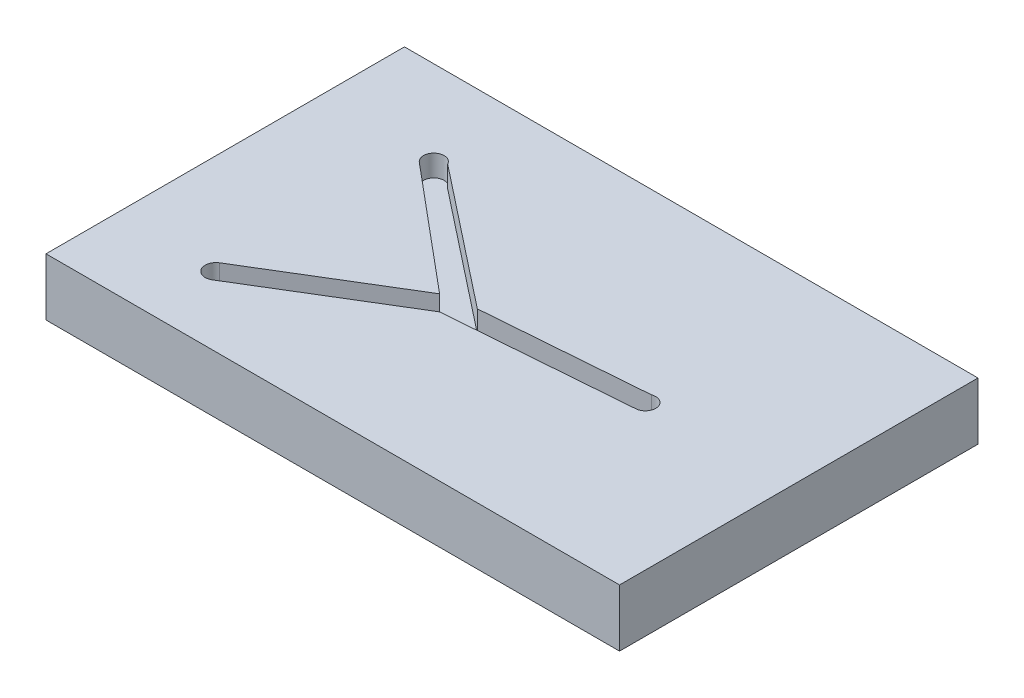
ISO-10303-21;
HEADER;
FILE_DESCRIPTION(('STEP AP214'),'2;1');
FILE_NAME('part.step','',(''),(''),'','','');
FILE_SCHEMA(('AUTOMOTIVE_DESIGN { 1 0 10303 214 1 1 1 1 }'));
ENDSEC;
DATA;
#1=APPLICATION_CONTEXT('core data for automotive mechanical design processes');
#2=APPLICATION_PROTOCOL_DEFINITION('international standard','automotive_design',2000,#1);
#3=PRODUCT_CONTEXT('',#1,'mechanical');
#4=PRODUCT('Part','Part','',(#3));
#5=PRODUCT_RELATED_PRODUCT_CATEGORY('part','',(#4));
#6=PRODUCT_DEFINITION_FORMATION('','',#4);
#7=PRODUCT_DEFINITION_CONTEXT('part definition',#1,'design');
#8=PRODUCT_DEFINITION('design','',#6,#7);
#9=PRODUCT_DEFINITION_SHAPE('','',#8);
#10=(LENGTH_UNIT() NAMED_UNIT(*) SI_UNIT(.MILLI.,.METRE.));
#11=(NAMED_UNIT(*) PLANE_ANGLE_UNIT() SI_UNIT($,.RADIAN.));
#12=(NAMED_UNIT(*) SI_UNIT($,.STERADIAN.) SOLID_ANGLE_UNIT());
#13=UNCERTAINTY_MEASURE_WITH_UNIT(LENGTH_MEASURE(1.E-05),#10,'distance_accuracy_value','');
#14=(GEOMETRIC_REPRESENTATION_CONTEXT(3) GLOBAL_UNCERTAINTY_ASSIGNED_CONTEXT((#13)) GLOBAL_UNIT_ASSIGNED_CONTEXT((#10,
#11,#12)) REPRESENTATION_CONTEXT('',''));
#15=CARTESIAN_POINT('',(0.,0.,0.));
#16=DIRECTION('',(0.,0.,1.));
#17=DIRECTION('',(1.,0.,0.));
#18=AXIS2_PLACEMENT_3D('',#15,#16,#17);
#19=CARTESIAN_POINT('',(21.8693544145681,-9.07594430361391,-10.8091795832));
#20=DIRECTION('',(-1.,0.,0.));
#21=DIRECTION('',(0.,0.,1.));
#22=AXIS2_PLACEMENT_3D('',#19,#20,#21);
#23=PLANE('',#22);
#24=DIRECTION('',(0.,0.,1.));
#25=VECTOR('',#24,1.);
#26=CARTESIAN_POINT('',(21.8693544145681,-1.07594430361391,-10.8091795832));
#27=LINE('',#26,#25);
#28=CARTESIAN_POINT('',(21.8693544145681,-1.07594430361391,-10.8091795832));
#29=VERTEX_POINT('',#28);
#30=CARTESIAN_POINT('',(21.8693544145681,-1.07594430361391,39.1908204168));
#31=VERTEX_POINT('',#30);
#32=EDGE_CURVE('E235',#29,#31,#27,.T.);
#33=ORIENTED_EDGE('',*,*,#32,.T.);
#34=DIRECTION('',(0.,1.,0.));
#35=VECTOR('',#34,1.);
#36=CARTESIAN_POINT('',(21.8693544145681,-9.07594430361391,39.1908204168));
#37=LINE('',#36,#35);
#38=CARTESIAN_POINT('',(21.8693544145681,-9.07594430361391,39.1908204168));
#39=VERTEX_POINT('',#38);
#40=EDGE_CURVE('E11',#39,#31,#37,.T.);
#41=ORIENTED_EDGE('',*,*,#40,.F.);
#42=DIRECTION('',(0.,0.,1.));
#43=VECTOR('',#42,1.);
#44=CARTESIAN_POINT('',(21.8693544145681,-9.07594430361391,-10.8091795832));
#45=LINE('',#44,#43);
#46=CARTESIAN_POINT('',(21.8693544145681,-9.07594430361391,-10.8091795832));
#47=VERTEX_POINT('',#46);
#48=EDGE_CURVE('E255',#47,#39,#45,.T.);
#49=ORIENTED_EDGE('',*,*,#48,.F.);
#50=DIRECTION('',(0.,1.,0.));
#51=VECTOR('',#50,1.);
#52=CARTESIAN_POINT('',(21.8693544145681,-9.07594430361391,-10.8091795832));
#53=LINE('',#52,#51);
#54=EDGE_CURVE('E72',#47,#29,#53,.T.);
#55=ORIENTED_EDGE('',*,*,#54,.T.);
#56=EDGE_LOOP('',(#33,#41,#49,#55));
#57=FACE_BOUND('',#56,.T.);
#58=ADVANCED_FACE('F50',(#57),#23,.F.);
#59=CARTESIAN_POINT('',(21.8693544145681,-9.07594430361391,39.1908204168));
#60=DIRECTION('',(0.,0.,-1.));
#61=DIRECTION('',(-1.,0.,0.));
#62=AXIS2_PLACEMENT_3D('',#59,#60,#61);
#63=PLANE('',#62);
#64=DIRECTION('',(-1.,0.,0.));
#65=VECTOR('',#64,1.);
#66=CARTESIAN_POINT('',(21.8693544145681,-1.07594430361391,39.1908204168));
#67=LINE('',#66,#65);
#68=CARTESIAN_POINT('',(-58.1306455854319,-1.07594430361391,39.1908204168));
#69=VERTEX_POINT('',#68);
#70=EDGE_CURVE('E267',#31,#69,#67,.T.);
#71=ORIENTED_EDGE('',*,*,#70,.T.);
#72=DIRECTION('',(0.,1.,0.));
#73=VECTOR('',#72,1.);
#74=CARTESIAN_POINT('',(-58.1306455854319,-9.07594430361391,39.1908204168));
#75=LINE('',#74,#73);
#76=CARTESIAN_POINT('',(-58.1306455854319,-9.07594430361391,39.1908204168));
#77=VERTEX_POINT('',#76);
#78=EDGE_CURVE('E54',#77,#69,#75,.T.);
#79=ORIENTED_EDGE('',*,*,#78,.F.);
#80=DIRECTION('',(-1.,0.,0.));
#81=VECTOR('',#80,1.);
#82=CARTESIAN_POINT('',(21.8693544145681,-9.07594430361391,39.1908204168));
#83=LINE('',#82,#81);
#84=EDGE_CURVE('E100',#39,#77,#83,.T.);
#85=ORIENTED_EDGE('',*,*,#84,.F.);
#86=ORIENTED_EDGE('',*,*,#40,.T.);
#87=EDGE_LOOP('',(#71,#79,#85,#86));
#88=FACE_BOUND('',#87,.T.);
#89=ADVANCED_FACE('F288',(#88),#63,.F.);
#90=CARTESIAN_POINT('',(-58.1306455854319,-9.07594430361391,-10.8091795832));
#91=DIRECTION('',(-1.,0.,0.));
#92=DIRECTION('',(0.,0.,1.));
#93=AXIS2_PLACEMENT_3D('',#90,#91,#92);
#94=PLANE('',#93);
#95=DIRECTION('',(0.,0.,1.));
#96=VECTOR('',#95,1.);
#97=CARTESIAN_POINT('',(-58.1306455854319,-1.07594430361391,-10.8091795832));
#98=LINE('',#97,#96);
#99=CARTESIAN_POINT('',(-58.1306455854319,-1.07594430361391,-10.8091795832));
#100=VERTEX_POINT('',#99);
#101=EDGE_CURVE('E272',#100,#69,#98,.T.);
#102=ORIENTED_EDGE('',*,*,#101,.F.);
#103=DIRECTION('',(0.,1.,0.));
#104=VECTOR('',#103,1.);
#105=CARTESIAN_POINT('',(-58.1306455854319,-9.07594430361391,-10.8091795832));
#106=LINE('',#105,#104);
#107=CARTESIAN_POINT('',(-58.1306455854319,-9.07594430361391,-10.8091795832));
#108=VERTEX_POINT('',#107);
#109=EDGE_CURVE('E281',#108,#100,#106,.T.);
#110=ORIENTED_EDGE('',*,*,#109,.F.);
#111=DIRECTION('',(0.,0.,1.));
#112=VECTOR('',#111,1.);
#113=CARTESIAN_POINT('',(-58.1306455854319,-9.07594430361391,-10.8091795832));
#114=LINE('',#113,#112);
#115=EDGE_CURVE('E257',#108,#77,#114,.T.);
#116=ORIENTED_EDGE('',*,*,#115,.T.);
#117=ORIENTED_EDGE('',*,*,#78,.T.);
#118=EDGE_LOOP('',(#102,#110,#116,#117));
#119=FACE_BOUND('',#118,.T.);
#120=ADVANCED_FACE('F286',(#119),#94,.T.);
#121=CARTESIAN_POINT('',(21.8693544145681,-9.07594430361391,-10.8091795832));
#122=DIRECTION('',(0.,0.,-1.));
#123=DIRECTION('',(-1.,0.,0.));
#124=AXIS2_PLACEMENT_3D('',#121,#122,#123);
#125=PLANE('',#124);
#126=DIRECTION('',(-1.,0.,0.));
#127=VECTOR('',#126,1.);
#128=CARTESIAN_POINT('',(21.8693544145681,-1.07594430361391,-10.8091795832));
#129=LINE('',#128,#127);
#130=EDGE_CURVE('E260',#29,#100,#129,.T.);
#131=ORIENTED_EDGE('',*,*,#130,.F.);
#132=ORIENTED_EDGE('',*,*,#54,.F.);
#133=DIRECTION('',(-1.,0.,0.));
#134=VECTOR('',#133,1.);
#135=CARTESIAN_POINT('',(21.8693544145681,-9.07594430361391,-10.8091795832));
#136=LINE('',#135,#134);
#137=EDGE_CURVE('E262',#47,#108,#136,.T.);
#138=ORIENTED_EDGE('',*,*,#137,.T.);
#139=ORIENTED_EDGE('',*,*,#109,.T.);
#140=EDGE_LOOP('',(#131,#132,#138,#139));
#141=FACE_BOUND('',#140,.T.);
#142=ADVANCED_FACE('F291',(#141),#125,.T.);
#143=CARTESIAN_POINT('',(21.8693544145681,-9.07594430361391,-10.8091795832));
#144=DIRECTION('',(0.,-1.,0.));
#145=DIRECTION('',(0.,0.,-1.));
#146=AXIS2_PLACEMENT_3D('',#143,#144,#145);
#147=PLANE('',#146);
#148=ORIENTED_EDGE('',*,*,#48,.T.);
#149=ORIENTED_EDGE('',*,*,#84,.T.);
#150=ORIENTED_EDGE('',*,*,#115,.F.);
#151=ORIENTED_EDGE('',*,*,#137,.F.);
#152=EDGE_LOOP('',(#148,#149,#150,#151));
#153=FACE_BOUND('',#152,.T.);
#154=ADVANCED_FACE('F299',(#153),#147,.T.);
#155=CARTESIAN_POINT('',(21.8693544145681,-1.07594430361391,-10.8091795832));
#156=DIRECTION('',(0.,-1.,0.));
#157=DIRECTION('',(0.,0.,-1.));
#158=AXIS2_PLACEMENT_3D('',#155,#156,#157);
#159=PLANE('',#158);
#160=CARTESIAN_POINT('',(-42.2333178804155,-1.07594430361391,0.993685103509279));
#161=DIRECTION('',(0.,1.,0.));
#162=DIRECTION('',(0.,0.,1.));
#163=AXIS2_PLACEMENT_3D('',#160,#161,#162);
#164=CIRCLE('',#163,1.43885582938763);
#165=CARTESIAN_POINT('',(-40.9497582937833,-1.07594430361391,0.343469073771937));
#166=VERTEX_POINT('',#165);
#167=CARTESIAN_POINT('',(-43.156432283682,-1.07594430361391,2.09739063318857));
#168=VERTEX_POINT('',#167);
#169=EDGE_CURVE('E204',#166,#168,#164,.T.);
#170=ORIENTED_EDGE('',*,*,#169,.F.);
#171=DIRECTION('',(-0.785276376815164,0.,-0.619145388431545));
#172=VECTOR('',#171,1.);
#173=CARTESIAN_POINT('',(-15.8647165347762,-1.07594430361391,20.1215859027692));
#174=LINE('',#173,#172);
#175=CARTESIAN_POINT('',(-21.401173622636,-1.07594430361391,15.7564069983688));
#176=VERTEX_POINT('',#175);
#177=EDGE_CURVE('E61',#176,#166,#174,.T.);
#178=ORIENTED_EDGE('',*,*,#177,.F.);
#179=DIRECTION('',(-0.996966044604979,0.,0.0778376894871828));
#180=VECTOR('',#179,1.);
#181=CARTESIAN_POINT('',(1.09305792709826,-1.07594430361391,14.0001796723772));
#182=LINE('',#181,#180);
#183=CARTESIAN_POINT('',(1.11553145494574,-1.07594430361391,13.9984250614837));
#184=VERTEX_POINT('',#183);
#185=EDGE_CURVE('E173',#184,#176,#182,.T.);
#186=ORIENTED_EDGE('',*,*,#185,.F.);
#187=CARTESIAN_POINT('',(1.62471908408542,-1.07594430361391,15.3441717152392));
#188=DIRECTION('',(0.,1.,0.));
#189=DIRECTION('',(0.,0.,1.));
#190=AXIS2_PLACEMENT_3D('',#187,#188,#189);
#191=CIRCLE('',#190,1.43885582938763);
#192=CARTESIAN_POINT('',(1.62471908408542,-1.07594430361391,16.7830275446268));
#193=VERTEX_POINT('',#192);
#194=EDGE_CURVE('E180',#193,#184,#191,.T.);
#195=ORIENTED_EDGE('',*,*,#194,.F.);
#196=DIRECTION('',(0.996966044604979,0.,-0.0778376894871827));
#197=VECTOR('',#196,1.);
#198=CARTESIAN_POINT('',(1.31223236782057,-1.07594430361391,16.8074248088276));
#199=LINE('',#198,#197);
#200=CARTESIAN_POINT('',(-23.6646986273798,-1.07594430361391,18.7574878121444));
#201=VERTEX_POINT('',#200);
#202=EDGE_CURVE('E224',#201,#193,#199,.T.);
#203=ORIENTED_EDGE('',*,*,#202,.F.);
#204=DIRECTION('',(-0.85461354300706,0.,0.51926456850908));
#205=VECTOR('',#204,1.);
#206=CARTESIAN_POINT('',(1.94317296465818,-1.07594430361391,3.19810368878081));
#207=LINE('',#206,#205);
#208=CARTESIAN_POINT('',(-43.3787818528378,-1.07594430361391,30.7357966084221));
#209=VERTEX_POINT('',#208);
#210=EDGE_CURVE('E218',#201,#209,#207,.T.);
#211=ORIENTED_EDGE('',*,*,#210,.T.);
#212=CARTESIAN_POINT('',(-44.1591573598928,-1.07594430361391,29.4547758950889));
#213=DIRECTION('',(0.,1.,0.));
#214=DIRECTION('',(0.,0.,1.));
#215=AXIS2_PLACEMENT_3D('',#212,#213,#214);
#216=CIRCLE('',#215,1.5);
#217=CARTESIAN_POINT('',(-44.9380542126564,-1.07594430361391,28.1728555805783));
#218=VERTEX_POINT('',#217);
#219=EDGE_CURVE('E214',#218,#209,#216,.T.);
#220=ORIENTED_EDGE('',*,*,#219,.F.);
#221=DIRECTION('',(0.85461354300706,0.,-0.51926456850908));
#222=VECTOR('',#221,1.);
#223=CARTESIAN_POINT('',(0.385379777651367,-1.07594430361391,0.634263913148445));
#224=LINE('',#223,#222);
#225=CARTESIAN_POINT('',(-25.8480450582511,-1.07594430361391,16.573735197443));
#226=VERTEX_POINT('',#225);
#227=EDGE_CURVE('E211',#218,#226,#224,.T.);
#228=ORIENTED_EDGE('',*,*,#227,.T.);
#229=DIRECTION('',(0.767071660090507,0.,0.641561429861547));
#230=VECTOR('',#229,1.);
#231=CARTESIAN_POINT('',(-18.7954090416233,-1.07594430361391,22.4724008404768));
#232=LINE('',#231,#230);
#233=EDGE_CURVE('E210',#168,#226,#232,.T.);
#234=ORIENTED_EDGE('',*,*,#233,.F.);
#235=EDGE_LOOP('',(#170,#178,#186,#195,#203,#211,#220,#228,#234));
#236=FACE_BOUND('',#235,.T.);
#237=ORIENTED_EDGE('',*,*,#32,.F.);
#238=ORIENTED_EDGE('',*,*,#130,.T.);
#239=ORIENTED_EDGE('',*,*,#101,.T.);
#240=ORIENTED_EDGE('',*,*,#70,.F.);
#241=EDGE_LOOP('',(#237,#238,#239,#240));
#242=FACE_BOUND('',#241,.T.);
#243=ADVANCED_FACE('F295',(#236,#242),#159,.F.);
#244=CARTESIAN_POINT('',(-15.8647165347762,-4.07594430361391,20.1215859027692));
#245=DIRECTION('',(0.619145388431545,0.,-0.785276376815164));
#246=DIRECTION('',(-0.785276376815164,0.,-0.619145388431545));
#247=AXIS2_PLACEMENT_3D('',#244,#245,#246);
#248=PLANE('',#247);
#249=ORIENTED_EDGE('',*,*,#177,.T.);
#250=DIRECTION('',(0.,1.,0.));
#251=VECTOR('',#250,1.);
#252=CARTESIAN_POINT('',(-40.9497582937833,-4.07594430361391,0.343469073771942));
#253=LINE('',#252,#251);
#254=CARTESIAN_POINT('',(-40.9497582937833,-4.07594430361391,0.343469073771942));
#255=VERTEX_POINT('',#254);
#256=EDGE_CURVE('E146',#255,#166,#253,.T.);
#257=ORIENTED_EDGE('',*,*,#256,.F.);
#258=DIRECTION('',(-0.785276376815164,0.,-0.619145388431545));
#259=VECTOR('',#258,1.);
#260=CARTESIAN_POINT('',(-15.8647165347762,-4.07594430361391,20.1215859027692));
#261=LINE('',#260,#259);
#262=CARTESIAN_POINT('',(-21.401173622636,-4.07594430361391,15.7564069983688));
#263=VERTEX_POINT('',#262);
#264=EDGE_CURVE('E155',#263,#255,#261,.T.);
#265=ORIENTED_EDGE('',*,*,#264,.F.);
#266=DIRECTION('',(0.,1.,0.));
#267=VECTOR('',#266,1.);
#268=CARTESIAN_POINT('',(-21.401173622636,-4.07594430361391,15.7564069983688));
#269=LINE('',#268,#267);
#270=EDGE_CURVE('E227',#263,#176,#269,.T.);
#271=ORIENTED_EDGE('',*,*,#270,.T.);
#272=EDGE_LOOP('',(#249,#257,#265,#271));
#273=FACE_BOUND('',#272,.T.);
#274=ADVANCED_FACE('F147',(#273),#248,.F.);
#275=CARTESIAN_POINT('',(1.09305792709826,-4.07594430361391,14.0001796723772));
#276=DIRECTION('',(-0.0778376894871828,0.,-0.996966044604979));
#277=DIRECTION('',(-0.996966044604979,0.,0.0778376894871828));
#278=AXIS2_PLACEMENT_3D('',#275,#276,#277);
#279=PLANE('',#278);
#280=ORIENTED_EDGE('',*,*,#185,.T.);
#281=ORIENTED_EDGE('',*,*,#270,.F.);
#282=DIRECTION('',(-0.996966044604979,0.,0.0778376894871828));
#283=VECTOR('',#282,1.);
#284=CARTESIAN_POINT('',(1.09305792709826,-4.07594430361391,14.0001796723772));
#285=LINE('',#284,#283);
#286=CARTESIAN_POINT('',(1.11553145494574,-4.07594430361391,13.9984250614837));
#287=VERTEX_POINT('',#286);
#288=EDGE_CURVE('E157',#287,#263,#285,.T.);
#289=ORIENTED_EDGE('',*,*,#288,.F.);
#290=DIRECTION('',(0.,1.,0.));
#291=VECTOR('',#290,1.);
#292=CARTESIAN_POINT('',(1.11553145494574,-4.07594430361391,13.9984250614837));
#293=LINE('',#292,#291);
#294=EDGE_CURVE('E233',#287,#184,#293,.T.);
#295=ORIENTED_EDGE('',*,*,#294,.T.);
#296=EDGE_LOOP('',(#280,#281,#289,#295));
#297=FACE_BOUND('',#296,.T.);
#298=ADVANCED_FACE('F312',(#297),#279,.F.);
#299=CARTESIAN_POINT('',(1.62471908408542,-4.07594430361391,15.3441717152392));
#300=DIRECTION('',(0.,1.,0.));
#301=DIRECTION('',(0.,0.,1.));
#302=AXIS2_PLACEMENT_3D('',#299,#300,#301);
#303=CYLINDRICAL_SURFACE('',#302,1.43885582938763);
#304=ORIENTED_EDGE('',*,*,#194,.T.);
#305=ORIENTED_EDGE('',*,*,#294,.F.);
#306=CARTESIAN_POINT('',(1.62471908408542,-4.07594430361391,15.3441717152392));
#307=DIRECTION('',(0.,1.,0.));
#308=DIRECTION('',(0.,0.,1.));
#309=AXIS2_PLACEMENT_3D('',#306,#307,#308);
#310=CIRCLE('',#309,1.43885582938763);
#311=CARTESIAN_POINT('',(1.62471908408542,-4.07594430361391,16.7830275446268));
#312=VERTEX_POINT('',#311);
#313=EDGE_CURVE('E197',#312,#287,#310,.T.);
#314=ORIENTED_EDGE('',*,*,#313,.F.);
#315=DIRECTION('',(0.,1.,0.));
#316=VECTOR('',#315,1.);
#317=CARTESIAN_POINT('',(1.62471908408542,-4.07594430361391,16.7830275446268));
#318=LINE('',#317,#316);
#319=EDGE_CURVE('E240',#312,#193,#318,.T.);
#320=ORIENTED_EDGE('',*,*,#319,.T.);
#321=EDGE_LOOP('',(#304,#305,#314,#320));
#322=FACE_BOUND('',#321,.T.);
#323=ADVANCED_FACE('F336',(#322),#303,.F.);
#324=CARTESIAN_POINT('',(1.31223236782057,-4.07594430361391,16.8074248088276));
#325=DIRECTION('',(0.0778376894871827,0.,0.996966044604979));
#326=DIRECTION('',(0.996966044604979,0.,-0.0778376894871827));
#327=AXIS2_PLACEMENT_3D('',#324,#325,#326);
#328=PLANE('',#327);
#329=ORIENTED_EDGE('',*,*,#202,.T.);
#330=ORIENTED_EDGE('',*,*,#319,.F.);
#331=DIRECTION('',(0.996966044604979,0.,-0.0778376894871827));
#332=VECTOR('',#331,1.);
#333=CARTESIAN_POINT('',(1.31223236782057,-4.07594430361391,16.8074248088276));
#334=LINE('',#333,#332);
#335=CARTESIAN_POINT('',(-23.6646986273798,-4.07594430361391,18.7574878121444));
#336=VERTEX_POINT('',#335);
#337=EDGE_CURVE('E195',#336,#312,#334,.T.);
#338=ORIENTED_EDGE('',*,*,#337,.F.);
#339=DIRECTION('',(0.,1.,0.));
#340=VECTOR('',#339,1.);
#341=CARTESIAN_POINT('',(-23.6646986273798,-4.07594430361391,18.7574878121444));
#342=LINE('',#341,#340);
#343=EDGE_CURVE('E238',#336,#201,#342,.T.);
#344=ORIENTED_EDGE('',*,*,#343,.T.);
#345=EDGE_LOOP('',(#329,#330,#338,#344));
#346=FACE_BOUND('',#345,.T.);
#347=ADVANCED_FACE('F334',(#346),#328,.F.);
#348=CARTESIAN_POINT('',(1.94317296465818,-4.07594430361391,3.19810368878081));
#349=DIRECTION('',(-0.51926456850908,0.,-0.85461354300706));
#350=DIRECTION('',(-0.85461354300706,0.,0.51926456850908));
#351=AXIS2_PLACEMENT_3D('',#348,#349,#350);
#352=PLANE('',#351);
#353=ORIENTED_EDGE('',*,*,#210,.F.);
#354=ORIENTED_EDGE('',*,*,#343,.F.);
#355=DIRECTION('',(-0.85461354300706,0.,0.51926456850908));
#356=VECTOR('',#355,1.);
#357=CARTESIAN_POINT('',(1.94317296465818,-4.07594430361391,3.19810368878081));
#358=LINE('',#357,#356);
#359=CARTESIAN_POINT('',(-43.3787818528378,-4.07594430361391,30.7357966084221));
#360=VERTEX_POINT('',#359);
#361=EDGE_CURVE('E187',#336,#360,#358,.T.);
#362=ORIENTED_EDGE('',*,*,#361,.T.);
#363=DIRECTION('',(0.,1.,0.));
#364=VECTOR('',#363,1.);
#365=CARTESIAN_POINT('',(-43.3787818528378,-4.07594430361391,30.7357966084221));
#366=LINE('',#365,#364);
#367=EDGE_CURVE('E245',#360,#209,#366,.T.);
#368=ORIENTED_EDGE('',*,*,#367,.T.);
#369=EDGE_LOOP('',(#353,#354,#362,#368));
#370=FACE_BOUND('',#369,.T.);
#371=ADVANCED_FACE('F328',(#370),#352,.T.);
#372=CARTESIAN_POINT('',(-44.1591573598928,-4.07594430361391,29.4547758950889));
#373=DIRECTION('',(0.,1.,0.));
#374=DIRECTION('',(0.,0.,1.));
#375=AXIS2_PLACEMENT_3D('',#372,#373,#374);
#376=CYLINDRICAL_SURFACE('',#375,1.5);
#377=ORIENTED_EDGE('',*,*,#219,.T.);
#378=ORIENTED_EDGE('',*,*,#367,.F.);
#379=CARTESIAN_POINT('',(-44.1591573598928,-4.07594430361391,29.4547758950889));
#380=DIRECTION('',(0.,1.,0.));
#381=DIRECTION('',(0.,0.,1.));
#382=AXIS2_PLACEMENT_3D('',#379,#380,#381);
#383=CIRCLE('',#382,1.5);
#384=CARTESIAN_POINT('',(-44.9380542126564,-4.07594430361391,28.1728555805783));
#385=VERTEX_POINT('',#384);
#386=EDGE_CURVE('E189',#385,#360,#383,.T.);
#387=ORIENTED_EDGE('',*,*,#386,.F.);
#388=DIRECTION('',(0.,1.,0.));
#389=VECTOR('',#388,1.);
#390=CARTESIAN_POINT('',(-44.9380542126564,-4.07594430361391,28.1728555805783));
#391=LINE('',#390,#389);
#392=EDGE_CURVE('E249',#385,#218,#391,.T.);
#393=ORIENTED_EDGE('',*,*,#392,.T.);
#394=EDGE_LOOP('',(#377,#378,#387,#393));
#395=FACE_BOUND('',#394,.T.);
#396=ADVANCED_FACE('F324',(#395),#376,.F.);
#397=CARTESIAN_POINT('',(0.385379777651367,-4.07594430361391,0.634263913148445));
#398=DIRECTION('',(0.51926456850908,0.,0.85461354300706));
#399=DIRECTION('',(0.85461354300706,0.,-0.51926456850908));
#400=AXIS2_PLACEMENT_3D('',#397,#398,#399);
#401=PLANE('',#400);
#402=ORIENTED_EDGE('',*,*,#227,.F.);
#403=ORIENTED_EDGE('',*,*,#392,.F.);
#404=DIRECTION('',(0.85461354300706,0.,-0.51926456850908));
#405=VECTOR('',#404,1.);
#406=CARTESIAN_POINT('',(0.385379777651367,-4.07594430361391,0.634263913148445));
#407=LINE('',#406,#405);
#408=CARTESIAN_POINT('',(-25.8480450582511,-4.07594430361391,16.573735197443));
#409=VERTEX_POINT('',#408);
#410=EDGE_CURVE('E181',#385,#409,#407,.T.);
#411=ORIENTED_EDGE('',*,*,#410,.T.);
#412=DIRECTION('',(0.,1.,0.));
#413=VECTOR('',#412,1.);
#414=CARTESIAN_POINT('',(-25.8480450582511,-4.07594430361391,16.573735197443));
#415=LINE('',#414,#413);
#416=EDGE_CURVE('E248',#409,#226,#415,.T.);
#417=ORIENTED_EDGE('',*,*,#416,.T.);
#418=EDGE_LOOP('',(#402,#403,#411,#417));
#419=FACE_BOUND('',#418,.T.);
#420=ADVANCED_FACE('F321',(#419),#401,.T.);
#421=CARTESIAN_POINT('',(-18.7954090416233,-4.07594430361391,22.4724008404768));
#422=DIRECTION('',(-0.641561429861547,0.,0.767071660090507));
#423=DIRECTION('',(0.767071660090507,0.,0.641561429861547));
#424=AXIS2_PLACEMENT_3D('',#421,#422,#423);
#425=PLANE('',#424);
#426=ORIENTED_EDGE('',*,*,#233,.T.);
#427=ORIENTED_EDGE('',*,*,#416,.F.);
#428=DIRECTION('',(0.767071660090507,0.,0.641561429861547));
#429=VECTOR('',#428,1.);
#430=CARTESIAN_POINT('',(-18.7954090416233,-4.07594430361391,22.4724008404768));
#431=LINE('',#430,#429);
#432=CARTESIAN_POINT('',(-43.156432283682,-4.07594430361391,2.09739063318857));
#433=VERTEX_POINT('',#432);
#434=EDGE_CURVE('E169',#433,#409,#431,.T.);
#435=ORIENTED_EDGE('',*,*,#434,.F.);
#436=DIRECTION('',(0.,1.,0.));
#437=VECTOR('',#436,1.);
#438=CARTESIAN_POINT('',(-43.156432283682,-4.07594430361391,2.09739063318857));
#439=LINE('',#438,#437);
#440=EDGE_CURVE('E158',#433,#168,#439,.T.);
#441=ORIENTED_EDGE('',*,*,#440,.T.);
#442=EDGE_LOOP('',(#426,#427,#435,#441));
#443=FACE_BOUND('',#442,.T.);
#444=ADVANCED_FACE('F318',(#443),#425,.F.);
#445=CARTESIAN_POINT('',(-42.2333178804155,-4.07594430361391,0.993685103509279));
#446=DIRECTION('',(0.,1.,0.));
#447=DIRECTION('',(0.,0.,1.));
#448=AXIS2_PLACEMENT_3D('',#445,#446,#447);
#449=CYLINDRICAL_SURFACE('',#448,1.43885582938763);
#450=ORIENTED_EDGE('',*,*,#169,.T.);
#451=ORIENTED_EDGE('',*,*,#440,.F.);
#452=CARTESIAN_POINT('',(-42.2333178804155,-4.07594430361391,0.993685103509279));
#453=DIRECTION('',(0.,1.,0.));
#454=DIRECTION('',(0.,0.,1.));
#455=AXIS2_PLACEMENT_3D('',#452,#453,#454);
#456=CIRCLE('',#455,1.43885582938763);
#457=EDGE_CURVE('E165',#255,#433,#456,.T.);
#458=ORIENTED_EDGE('',*,*,#457,.F.);
#459=ORIENTED_EDGE('',*,*,#256,.T.);
#460=EDGE_LOOP('',(#450,#451,#458,#459));
#461=FACE_BOUND('',#460,.T.);
#462=ADVANCED_FACE('F162',(#461),#449,.F.);
#463=CARTESIAN_POINT('',(0.,-4.07594430361391,0.));
#464=DIRECTION('',(0.,1.,0.));
#465=DIRECTION('',(0.,0.,1.));
#466=AXIS2_PLACEMENT_3D('',#463,#464,#465);
#467=PLANE('',#466);
#468=ORIENTED_EDGE('',*,*,#264,.T.);
#469=ORIENTED_EDGE('',*,*,#457,.T.);
#470=ORIENTED_EDGE('',*,*,#434,.T.);
#471=ORIENTED_EDGE('',*,*,#410,.F.);
#472=ORIENTED_EDGE('',*,*,#386,.T.);
#473=ORIENTED_EDGE('',*,*,#361,.F.);
#474=ORIENTED_EDGE('',*,*,#337,.T.);
#475=ORIENTED_EDGE('',*,*,#313,.T.);
#476=ORIENTED_EDGE('',*,*,#288,.T.);
#477=EDGE_LOOP('',(#468,#469,#470,#471,#472,#473,#474,#475,#476));
#478=FACE_BOUND('',#477,.T.);
#479=ADVANCED_FACE('F168',(#478),#467,.T.);
#480=CLOSED_SHELL('',(#58,#89,#120,#142,#154,#243,#274,#298,#323,#347,#371,#396,#420,#444,#462,#479));
#481=MANIFOLD_SOLID_BREP('B2',#480);
#482=ADVANCED_BREP_SHAPE_REPRESENTATION('',(#18,#481),#14);
#483=SHAPE_DEFINITION_REPRESENTATION(#9,#482);
ENDSEC;
END-ISO-10303-21;
